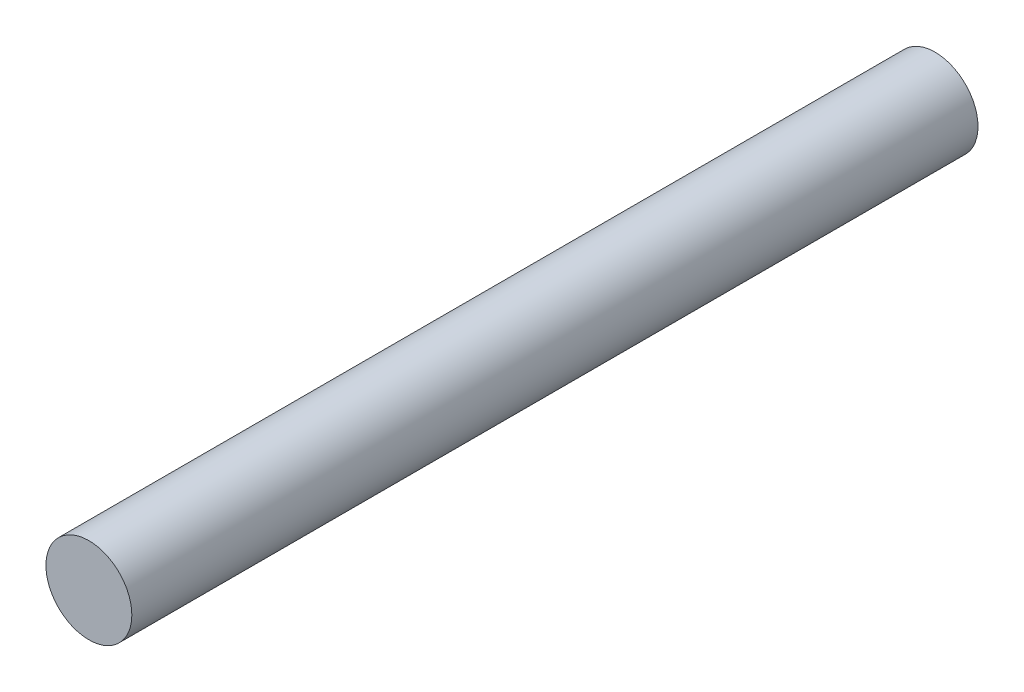
ISO-10303-21;
HEADER;
FILE_DESCRIPTION(('STEP AP214'),'2;1');
FILE_NAME('part.step','',(''),(''),'','','');
FILE_SCHEMA(('AUTOMOTIVE_DESIGN { 1 0 10303 214 1 1 1 1 }'));
ENDSEC;
DATA;
#1=APPLICATION_CONTEXT('core data for automotive mechanical design processes');
#2=APPLICATION_PROTOCOL_DEFINITION('international standard','automotive_design',2000,#1);
#3=PRODUCT_CONTEXT('',#1,'mechanical');
#4=PRODUCT('Part','Part','',(#3));
#5=PRODUCT_RELATED_PRODUCT_CATEGORY('part','',(#4));
#6=PRODUCT_DEFINITION_FORMATION('','',#4);
#7=PRODUCT_DEFINITION_CONTEXT('part definition',#1,'design');
#8=PRODUCT_DEFINITION('design','',#6,#7);
#9=PRODUCT_DEFINITION_SHAPE('','',#8);
#10=(LENGTH_UNIT() NAMED_UNIT(*) SI_UNIT(.MILLI.,.METRE.));
#11=(NAMED_UNIT(*) PLANE_ANGLE_UNIT() SI_UNIT($,.RADIAN.));
#12=(NAMED_UNIT(*) SI_UNIT($,.STERADIAN.) SOLID_ANGLE_UNIT());
#13=UNCERTAINTY_MEASURE_WITH_UNIT(LENGTH_MEASURE(1.E-05),#10,'distance_accuracy_value','');
#14=(GEOMETRIC_REPRESENTATION_CONTEXT(3) GLOBAL_UNCERTAINTY_ASSIGNED_CONTEXT((#13)) GLOBAL_UNIT_ASSIGNED_CONTEXT((#10,
#11,#12)) REPRESENTATION_CONTEXT('',''));
#15=CARTESIAN_POINT('',(0.,0.,0.));
#16=DIRECTION('',(0.,0.,1.));
#17=DIRECTION('',(1.,0.,0.));
#18=AXIS2_PLACEMENT_3D('',#15,#16,#17);
#19=CARTESIAN_POINT('',(0.,0.,93.8022));
#20=DIRECTION('',(0.,0.,-1.));
#21=DIRECTION('',(-1.,0.,0.));
#22=AXIS2_PLACEMENT_3D('',#19,#20,#21);
#23=CYLINDRICAL_SURFACE('',#22,4.7625);
#24=CARTESIAN_POINT('',(0.,0.,93.8022));
#25=DIRECTION('',(0.,0.,1.));
#26=DIRECTION('',(1.,0.,0.));
#27=AXIS2_PLACEMENT_3D('',#24,#25,#26);
#28=CIRCLE('',#27,4.7625);
#29=CARTESIAN_POINT('',(4.7625,0.,93.8022));
#30=VERTEX_POINT('',#29);
#31=EDGE_CURVE('E10',#30,#30,#28,.T.);
#32=ORIENTED_EDGE('',*,*,#31,.F.);
#33=EDGE_LOOP('',(#32));
#34=FACE_BOUND('',#33,.T.);
#35=CARTESIAN_POINT('',(0.,0.,0.));
#36=DIRECTION('',(0.,0.,1.));
#37=DIRECTION('',(1.,0.,0.));
#38=AXIS2_PLACEMENT_3D('',#35,#36,#37);
#39=CIRCLE('',#38,4.7625);
#40=CARTESIAN_POINT('',(4.7625,0.,0.));
#41=VERTEX_POINT('',#40);
#42=EDGE_CURVE('E33',#41,#41,#39,.T.);
#43=ORIENTED_EDGE('',*,*,#42,.T.);
#44=EDGE_LOOP('',(#43));
#45=FACE_BOUND('',#44,.T.);
#46=ADVANCED_FACE('F30',(#34,#45),#23,.T.);
#47=CARTESIAN_POINT('',(0.,0.,93.8022));
#48=DIRECTION('',(0.,0.,1.));
#49=DIRECTION('',(1.,0.,0.));
#50=AXIS2_PLACEMENT_3D('',#47,#48,#49);
#51=PLANE('',#50);
#52=ORIENTED_EDGE('',*,*,#31,.T.);
#53=EDGE_LOOP('',(#52));
#54=FACE_BOUND('',#53,.T.);
#55=ADVANCED_FACE('F45',(#54),#51,.T.);
#56=CARTESIAN_POINT('',(0.,0.,0.));
#57=DIRECTION('',(0.,0.,1.));
#58=DIRECTION('',(1.,0.,0.));
#59=AXIS2_PLACEMENT_3D('',#56,#57,#58);
#60=PLANE('',#59);
#61=ORIENTED_EDGE('',*,*,#42,.F.);
#62=EDGE_LOOP('',(#61));
#63=FACE_BOUND('',#62,.T.);
#64=ADVANCED_FACE('F43',(#63),#60,.F.);
#65=CLOSED_SHELL('',(#46,#55,#64));
#66=MANIFOLD_SOLID_BREP('B2',#65);
#67=ADVANCED_BREP_SHAPE_REPRESENTATION('',(#18,#66),#14);
#68=SHAPE_DEFINITION_REPRESENTATION(#9,#67);
ENDSEC;
END-ISO-10303-21;
